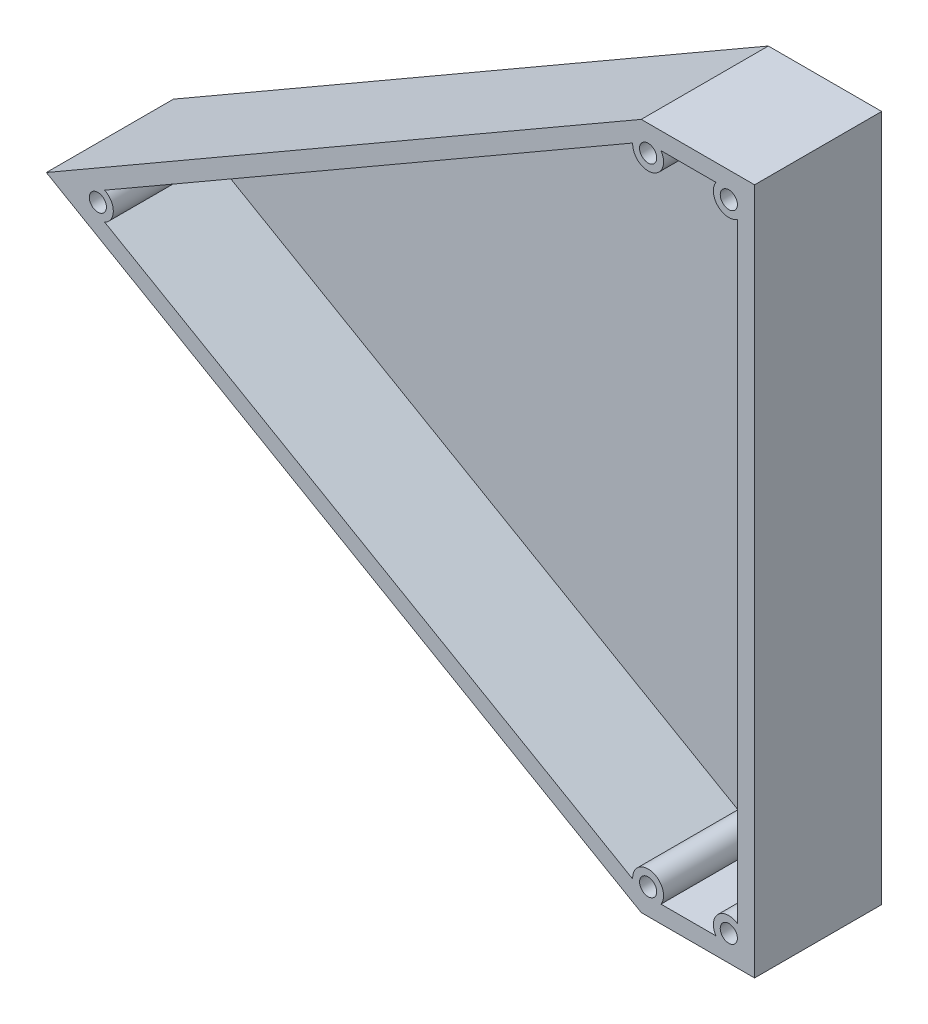
ISO-10303-21;
HEADER;
FILE_DESCRIPTION(('STEP AP214'),'2;1');
FILE_NAME('part.step','',(''),(''),'','','');
FILE_SCHEMA(('AUTOMOTIVE_DESIGN { 1 0 10303 214 1 1 1 1 }'));
ENDSEC;
DATA;
#1=APPLICATION_CONTEXT('core data for automotive mechanical design processes');
#2=APPLICATION_PROTOCOL_DEFINITION('international standard','automotive_design',2000,#1);
#3=PRODUCT_CONTEXT('',#1,'mechanical');
#4=PRODUCT('Part','Part','',(#3));
#5=PRODUCT_RELATED_PRODUCT_CATEGORY('part','',(#4));
#6=PRODUCT_DEFINITION_FORMATION('','',#4);
#7=PRODUCT_DEFINITION_CONTEXT('part definition',#1,'design');
#8=PRODUCT_DEFINITION('design','',#6,#7);
#9=PRODUCT_DEFINITION_SHAPE('','',#8);
#10=(LENGTH_UNIT() NAMED_UNIT(*) SI_UNIT(.MILLI.,.METRE.));
#11=(NAMED_UNIT(*) PLANE_ANGLE_UNIT() SI_UNIT($,.RADIAN.));
#12=(NAMED_UNIT(*) SI_UNIT($,.STERADIAN.) SOLID_ANGLE_UNIT());
#13=UNCERTAINTY_MEASURE_WITH_UNIT(LENGTH_MEASURE(1.E-05),#10,'distance_accuracy_value','');
#14=(GEOMETRIC_REPRESENTATION_CONTEXT(3) GLOBAL_UNCERTAINTY_ASSIGNED_CONTEXT((#13)) GLOBAL_UNIT_ASSIGNED_CONTEXT((#10,
#11,#12)) REPRESENTATION_CONTEXT('',''));
#15=CARTESIAN_POINT('',(0.,0.,0.));
#16=DIRECTION('',(0.,0.,1.));
#17=DIRECTION('',(1.,0.,0.));
#18=AXIS2_PLACEMENT_3D('',#15,#16,#17);
#19=CARTESIAN_POINT('',(-94.2275403784437,-163.206887407713,5.));
#20=DIRECTION('',(-0.499999999999999,-0.866025403784439,0.));
#21=DIRECTION('',(0.866025403784439,-0.499999999999999,0.));
#22=AXIS2_PLACEMENT_3D('',#19,#20,#21);
#23=PLANE('',#22);
#24=DIRECTION('',(-0.866025403784439,0.499999999999999,0.));
#25=VECTOR('',#24,1.);
#26=CARTESIAN_POINT('',(-94.2275403784437,-163.206887407713,0.));
#27=LINE('',#26,#25);
#28=CARTESIAN_POINT('',(-30.5,-200.,0.));
#29=VERTEX_POINT('',#28);
#30=CARTESIAN_POINT('',(-203.705080756888,-100.,0.));
#31=VERTEX_POINT('',#30);
#32=EDGE_CURVE('E241',#29,#31,#27,.T.);
#33=ORIENTED_EDGE('',*,*,#32,.F.);
#34=DIRECTION('',(0.,0.,-1.));
#35=VECTOR('',#34,1.);
#36=CARTESIAN_POINT('',(-30.5,-200.,5.));
#37=LINE('',#36,#35);
#38=CARTESIAN_POINT('',(-30.5,-200.,37.));
#39=VERTEX_POINT('',#38);
#40=EDGE_CURVE('E264',#39,#29,#37,.T.);
#41=ORIENTED_EDGE('',*,*,#40,.F.);
#42=DIRECTION('',(0.866025403784439,-0.499999999999999,0.));
#43=VECTOR('',#42,1.);
#44=CARTESIAN_POINT('',(-203.705080756888,-100.,37.));
#45=LINE('',#44,#43);
#46=CARTESIAN_POINT('',(-203.705080756888,-100.,37.));
#47=VERTEX_POINT('',#46);
#48=EDGE_CURVE('E229',#47,#39,#45,.T.);
#49=ORIENTED_EDGE('',*,*,#48,.F.);
#50=DIRECTION('',(0.,0.,-1.));
#51=VECTOR('',#50,1.);
#52=CARTESIAN_POINT('',(-203.705080756888,-100.,5.));
#53=LINE('',#52,#51);
#54=EDGE_CURVE('E256',#47,#31,#53,.T.);
#55=ORIENTED_EDGE('',*,*,#54,.T.);
#56=EDGE_LOOP('',(#33,#41,#49,#55));
#57=FACE_BOUND('',#56,.T.);
#58=ADVANCED_FACE('F33',(#57),#23,.T.);
#59=CARTESIAN_POINT('',(0.,-200.,5.));
#60=DIRECTION('',(0.,-1.,0.));
#61=DIRECTION('',(0.,0.,-1.));
#62=AXIS2_PLACEMENT_3D('',#59,#60,#61);
#63=PLANE('',#62);
#64=DIRECTION('',(-1.,0.,0.));
#65=VECTOR('',#64,1.);
#66=CARTESIAN_POINT('',(0.,-200.,0.));
#67=LINE('',#66,#65);
#68=CARTESIAN_POINT('',(2.50000000000002,-200.,0.));
#69=VERTEX_POINT('',#68);
#70=EDGE_CURVE('E244',#69,#29,#67,.T.);
#71=ORIENTED_EDGE('',*,*,#70,.F.);
#72=DIRECTION('',(0.,0.,-1.));
#73=VECTOR('',#72,1.);
#74=CARTESIAN_POINT('',(2.50000000000002,-200.,5.));
#75=LINE('',#74,#73);
#76=CARTESIAN_POINT('',(2.50000000000002,-200.,37.));
#77=VERTEX_POINT('',#76);
#78=EDGE_CURVE('E262',#77,#69,#75,.T.);
#79=ORIENTED_EDGE('',*,*,#78,.F.);
#80=DIRECTION('',(1.,0.,0.));
#81=VECTOR('',#80,1.);
#82=CARTESIAN_POINT('',(-30.5,-200.,37.));
#83=LINE('',#82,#81);
#84=EDGE_CURVE('E232',#39,#77,#83,.T.);
#85=ORIENTED_EDGE('',*,*,#84,.F.);
#86=ORIENTED_EDGE('',*,*,#40,.T.);
#87=EDGE_LOOP('',(#71,#79,#85,#86));
#88=FACE_BOUND('',#87,.T.);
#89=ADVANCED_FACE('F294',(#88),#63,.T.);
#90=CARTESIAN_POINT('',(2.5,0.,5.));
#91=DIRECTION('',(1.,0.,0.));
#92=DIRECTION('',(0.,1.,0.));
#93=AXIS2_PLACEMENT_3D('',#90,#91,#92);
#94=PLANE('',#93);
#95=DIRECTION('',(0.,-1.,0.));
#96=VECTOR('',#95,1.);
#97=CARTESIAN_POINT('',(2.5,0.,0.));
#98=LINE('',#97,#96);
#99=CARTESIAN_POINT('',(2.5,0.,0.));
#100=VERTEX_POINT('',#99);
#101=EDGE_CURVE('E247',#100,#69,#98,.T.);
#102=ORIENTED_EDGE('',*,*,#101,.F.);
#103=DIRECTION('',(0.,0.,-1.));
#104=VECTOR('',#103,1.);
#105=CARTESIAN_POINT('',(2.5,0.,5.));
#106=LINE('',#105,#104);
#107=CARTESIAN_POINT('',(2.5,0.,37.));
#108=VERTEX_POINT('',#107);
#109=EDGE_CURVE('E260',#108,#100,#106,.T.);
#110=ORIENTED_EDGE('',*,*,#109,.F.);
#111=DIRECTION('',(0.,1.,0.));
#112=VECTOR('',#111,1.);
#113=CARTESIAN_POINT('',(2.50000000000002,-200.,37.));
#114=LINE('',#113,#112);
#115=EDGE_CURVE('E235',#77,#108,#114,.T.);
#116=ORIENTED_EDGE('',*,*,#115,.F.);
#117=ORIENTED_EDGE('',*,*,#78,.T.);
#118=EDGE_LOOP('',(#102,#110,#116,#117));
#119=FACE_BOUND('',#118,.T.);
#120=ADVANCED_FACE('F300',(#119),#94,.T.);
#121=CARTESIAN_POINT('',(0.,0.,5.));
#122=DIRECTION('',(0.,-1.,0.));
#123=DIRECTION('',(1.,0.,0.));
#124=AXIS2_PLACEMENT_3D('',#121,#122,#123);
#125=PLANE('',#124);
#126=DIRECTION('',(-1.,0.,0.));
#127=VECTOR('',#126,1.);
#128=CARTESIAN_POINT('',(0.,0.,0.));
#129=LINE('',#128,#127);
#130=CARTESIAN_POINT('',(-30.4999999999997,-8.74300631892311E-13,0.));
#131=VERTEX_POINT('',#130);
#132=EDGE_CURVE('E250',#100,#131,#129,.T.);
#133=ORIENTED_EDGE('',*,*,#132,.T.);
#134=DIRECTION('',(0.,0.,-1.));
#135=VECTOR('',#134,1.);
#136=CARTESIAN_POINT('',(-30.4999999999997,-8.74300631892311E-13,5.));
#137=LINE('',#136,#135);
#138=CARTESIAN_POINT('',(-30.4999999999997,-8.74300631892311E-13,37.));
#139=VERTEX_POINT('',#138);
#140=EDGE_CURVE('E258',#139,#131,#137,.T.);
#141=ORIENTED_EDGE('',*,*,#140,.F.);
#142=DIRECTION('',(-1.,0.,0.));
#143=VECTOR('',#142,1.);
#144=CARTESIAN_POINT('',(2.5,0.,37.));
#145=LINE('',#144,#143);
#146=EDGE_CURVE('E238',#108,#139,#145,.T.);
#147=ORIENTED_EDGE('',*,*,#146,.F.);
#148=ORIENTED_EDGE('',*,*,#109,.T.);
#149=EDGE_LOOP('',(#133,#141,#147,#148));
#150=FACE_BOUND('',#149,.T.);
#151=ADVANCED_FACE('F317',(#150),#125,.F.);
#152=CARTESIAN_POINT('',(-7.62499999999943,13.2068874077118,5.));
#153=DIRECTION('',(-0.499999999999997,0.86602540378444,0.));
#154=DIRECTION('',(-0.866025403784441,-0.499999999999997,0.));
#155=AXIS2_PLACEMENT_3D('',#152,#153,#154);
#156=PLANE('',#155);
#157=DIRECTION('',(0.866025403784441,0.499999999999997,0.));
#158=VECTOR('',#157,1.);
#159=CARTESIAN_POINT('',(-7.62499999999943,13.2068874077118,0.));
#160=LINE('',#159,#158);
#161=EDGE_CURVE('E253',#31,#131,#160,.T.);
#162=ORIENTED_EDGE('',*,*,#161,.F.);
#163=ORIENTED_EDGE('',*,*,#54,.F.);
#164=DIRECTION('',(-0.866025403784441,-0.499999999999997,0.));
#165=VECTOR('',#164,1.);
#166=CARTESIAN_POINT('',(-30.4999999999997,-8.74300631892311E-13,37.));
#167=LINE('',#166,#165);
#168=EDGE_CURVE('E226',#139,#47,#167,.T.);
#169=ORIENTED_EDGE('',*,*,#168,.F.);
#170=ORIENTED_EDGE('',*,*,#140,.T.);
#171=EDGE_LOOP('',(#162,#163,#169,#170));
#172=FACE_BOUND('',#171,.T.);
#173=ADVANCED_FACE('F319',(#172),#156,.T.);
#174=CARTESIAN_POINT('',(0.,0.,0.));
#175=DIRECTION('',(0.,0.,1.));
#176=DIRECTION('',(1.,0.,0.));
#177=AXIS2_PLACEMENT_3D('',#174,#175,#176);
#178=PLANE('',#177);
#179=ORIENTED_EDGE('',*,*,#32,.T.);
#180=ORIENTED_EDGE('',*,*,#161,.T.);
#181=ORIENTED_EDGE('',*,*,#132,.F.);
#182=ORIENTED_EDGE('',*,*,#101,.T.);
#183=ORIENTED_EDGE('',*,*,#70,.T.);
#184=EDGE_LOOP('',(#179,#180,#181,#182,#183));
#185=FACE_BOUND('',#184,.T.);
#186=ADVANCED_FACE('F307',(#185),#178,.F.);
#187=CARTESIAN_POINT('',(0.,0.,37.));
#188=DIRECTION('',(0.,0.,1.));
#189=DIRECTION('',(1.,0.,0.));
#190=AXIS2_PLACEMENT_3D('',#187,#188,#189);
#191=PLANE('',#190);
#192=CARTESIAN_POINT('',(-28.4903810567665,-192.5,37.));
#193=DIRECTION('',(0.,0.,1.));
#194=DIRECTION('',(1.,0.,0.));
#195=AXIS2_PLACEMENT_3D('',#192,#193,#194);
#196=CIRCLE('',#195,2.5);
#197=CARTESIAN_POINT('',(-25.9903810567665,-192.5,37.));
#198=VERTEX_POINT('',#197);
#199=EDGE_CURVE('E583',#198,#198,#196,.T.);
#200=ORIENTED_EDGE('',*,*,#199,.F.);
#201=EDGE_LOOP('',(#200));
#202=FACE_BOUND('',#201,.T.);
#203=DIRECTION('',(0.866025403784438,-0.5,0.));
#204=VECTOR('',#203,1.);
#205=CARTESIAN_POINT('',(-186.714710407684,-104.035892202848,37.));
#206=LINE('',#205,#204);
#207=CARTESIAN_POINT('',(-186.714710407684,-104.035892202848,37.));
#208=VERTEX_POINT('',#207);
#209=CARTESIAN_POINT('',(-32.9807514059704,-192.794234816074,37.));
#210=VERTEX_POINT('',#209);
#211=EDGE_CURVE('E147',#208,#210,#206,.T.);
#212=ORIENTED_EDGE('',*,*,#211,.F.);
#213=CARTESIAN_POINT('',(-188.705080756888,-99.9999999999999,37.));
#214=DIRECTION('',(0.,0.,-1.));
#215=DIRECTION('',(1.,0.,0.));
#216=AXIS2_PLACEMENT_3D('',#213,#214,#215);
#217=CIRCLE('',#216,4.49999999999999);
#218=CARTESIAN_POINT('',(-186.714710407684,-95.964107797152,37.));
#219=VERTEX_POINT('',#218);
#220=EDGE_CURVE('E138',#219,#208,#217,.T.);
#221=ORIENTED_EDGE('',*,*,#220,.F.);
#222=DIRECTION('',(-0.866025403784439,-0.499999999999999,0.));
#223=VECTOR('',#222,1.);
#224=CARTESIAN_POINT('',(-186.714710407684,-95.964107797152,37.));
#225=LINE('',#224,#223);
#226=CARTESIAN_POINT('',(-32.9807514059704,-7.20576518392587,37.));
#227=VERTEX_POINT('',#226);
#228=EDGE_CURVE('E178',#227,#219,#225,.T.);
#229=ORIENTED_EDGE('',*,*,#228,.F.);
#230=CARTESIAN_POINT('',(-28.4903810567665,-7.50000000000001,37.));
#231=DIRECTION('',(0.,0.,-1.));
#232=DIRECTION('',(-1.,0.,0.));
#233=AXIS2_PLACEMENT_3D('',#230,#231,#232);
#234=CIRCLE('',#233,4.5);
#235=CARTESIAN_POINT('',(-24.7487236699925,-5.00000000000001,37.));
#236=VERTEX_POINT('',#235);
#237=EDGE_CURVE('E175',#236,#227,#234,.T.);
#238=ORIENTED_EDGE('',*,*,#237,.F.);
#239=DIRECTION('',(-1.,0.,0.));
#240=VECTOR('',#239,1.);
#241=CARTESIAN_POINT('',(-8.74165738677392,-5.,37.));
#242=LINE('',#241,#240);
#243=CARTESIAN_POINT('',(-8.74165738677392,-5.,37.));
#244=VERTEX_POINT('',#243);
#245=EDGE_CURVE('E173',#244,#236,#242,.T.);
#246=ORIENTED_EDGE('',*,*,#245,.F.);
#247=CARTESIAN_POINT('',(-4.99999999999998,-7.50000000000001,37.));
#248=DIRECTION('',(0.,0.,-1.));
#249=DIRECTION('',(-1.,0.,0.));
#250=AXIS2_PLACEMENT_3D('',#247,#248,#249);
#251=CIRCLE('',#250,4.50000000000001);
#252=CARTESIAN_POINT('',(-2.49999999999998,-11.241657386774,37.));
#253=VERTEX_POINT('',#252);
#254=EDGE_CURVE('E171',#253,#244,#251,.T.);
#255=ORIENTED_EDGE('',*,*,#254,.F.);
#256=DIRECTION('',(0.,1.,0.));
#257=VECTOR('',#256,1.);
#258=CARTESIAN_POINT('',(-2.49999999999998,-188.758342613226,37.));
#259=LINE('',#258,#257);
#260=CARTESIAN_POINT('',(-2.49999999999998,-188.758342613226,37.));
#261=VERTEX_POINT('',#260);
#262=EDGE_CURVE('E169',#261,#253,#259,.T.);
#263=ORIENTED_EDGE('',*,*,#262,.F.);
#264=CARTESIAN_POINT('',(-4.99999999999998,-192.5,37.));
#265=DIRECTION('',(0.,0.,-1.));
#266=DIRECTION('',(1.,0.,0.));
#267=AXIS2_PLACEMENT_3D('',#264,#265,#266);
#268=CIRCLE('',#267,4.50000000000001);
#269=CARTESIAN_POINT('',(-8.74165738677392,-195.,37.));
#270=VERTEX_POINT('',#269);
#271=EDGE_CURVE('E167',#270,#261,#268,.T.);
#272=ORIENTED_EDGE('',*,*,#271,.F.);
#273=DIRECTION('',(1.,0.,0.));
#274=VECTOR('',#273,1.);
#275=CARTESIAN_POINT('',(-24.7487236699925,-195.,37.));
#276=LINE('',#275,#274);
#277=CARTESIAN_POINT('',(-24.7487236699925,-195.,37.));
#278=VERTEX_POINT('',#277);
#279=EDGE_CURVE('E162',#278,#270,#276,.T.);
#280=ORIENTED_EDGE('',*,*,#279,.F.);
#281=CARTESIAN_POINT('',(-28.4903810567665,-192.5,37.));
#282=DIRECTION('',(0.,0.,-1.));
#283=DIRECTION('',(1.,0.,0.));
#284=AXIS2_PLACEMENT_3D('',#281,#282,#283);
#285=CIRCLE('',#284,4.5);
#286=EDGE_CURVE('E160',#210,#278,#285,.T.);
#287=ORIENTED_EDGE('',*,*,#286,.F.);
#288=EDGE_LOOP('',(#212,#221,#229,#238,#246,#255,#263,#272,#280,#287));
#289=FACE_BOUND('',#288,.T.);
#290=CARTESIAN_POINT('',(-4.99999999999998,-192.5,37.));
#291=DIRECTION('',(0.,0.,1.));
#292=DIRECTION('',(1.,0.,0.));
#293=AXIS2_PLACEMENT_3D('',#290,#291,#292);
#294=CIRCLE('',#293,2.5);
#295=CARTESIAN_POINT('',(-2.49999999999997,-192.5,37.));
#296=VERTEX_POINT('',#295);
#297=EDGE_CURVE('E153',#296,#296,#294,.T.);
#298=ORIENTED_EDGE('',*,*,#297,.F.);
#299=EDGE_LOOP('',(#298));
#300=FACE_BOUND('',#299,.T.);
#301=ORIENTED_EDGE('',*,*,#168,.T.);
#302=ORIENTED_EDGE('',*,*,#48,.T.);
#303=ORIENTED_EDGE('',*,*,#84,.T.);
#304=ORIENTED_EDGE('',*,*,#115,.T.);
#305=ORIENTED_EDGE('',*,*,#146,.T.);
#306=EDGE_LOOP('',(#301,#302,#303,#304,#305));
#307=FACE_BOUND('',#306,.T.);
#308=CARTESIAN_POINT('',(-188.705080756888,-99.9999999999999,37.));
#309=DIRECTION('',(0.,0.,1.));
#310=DIRECTION('',(1.,0.,0.));
#311=AXIS2_PLACEMENT_3D('',#308,#309,#310);
#312=CIRCLE('',#311,2.50000000000017);
#313=CARTESIAN_POINT('',(-186.205080756888,-99.9999999999999,37.));
#314=VERTEX_POINT('',#313);
#315=EDGE_CURVE('E223',#314,#314,#312,.T.);
#316=ORIENTED_EDGE('',*,*,#315,.F.);
#317=EDGE_LOOP('',(#316));
#318=FACE_BOUND('',#317,.T.);
#319=CARTESIAN_POINT('',(-4.99999999999998,-7.50000000000001,37.));
#320=DIRECTION('',(0.,0.,1.));
#321=DIRECTION('',(-1.,0.,0.));
#322=AXIS2_PLACEMENT_3D('',#319,#320,#321);
#323=CIRCLE('',#322,2.5);
#324=CARTESIAN_POINT('',(-7.49999999999998,-7.50000000000001,37.));
#325=VERTEX_POINT('',#324);
#326=EDGE_CURVE('E181',#325,#325,#323,.T.);
#327=ORIENTED_EDGE('',*,*,#326,.F.);
#328=EDGE_LOOP('',(#327));
#329=FACE_BOUND('',#328,.T.);
#330=CARTESIAN_POINT('',(-28.4903810567665,-7.50000000000001,37.));
#331=DIRECTION('',(0.,0.,1.));
#332=DIRECTION('',(-1.,0.,0.));
#333=AXIS2_PLACEMENT_3D('',#330,#331,#332);
#334=CIRCLE('',#333,2.5);
#335=CARTESIAN_POINT('',(-30.9903810567665,-7.50000000000001,37.));
#336=VERTEX_POINT('',#335);
#337=EDGE_CURVE('E581',#336,#336,#334,.T.);
#338=ORIENTED_EDGE('',*,*,#337,.F.);
#339=EDGE_LOOP('',(#338));
#340=FACE_BOUND('',#339,.T.);
#341=ADVANCED_FACE('F157',(#202,#289,#300,#307,#318,#329,#340),#191,.T.);
#342=CARTESIAN_POINT('',(-188.705080756888,-99.9999999999999,37.));
#343=DIRECTION('',(0.,0.,-1.));
#344=DIRECTION('',(-1.,0.,0.));
#345=AXIS2_PLACEMENT_3D('',#342,#343,#344);
#346=CYLINDRICAL_SURFACE('',#345,2.50000000000017);
#347=ORIENTED_EDGE('',*,*,#315,.T.);
#348=EDGE_LOOP('',(#347));
#349=FACE_BOUND('',#348,.T.);
#350=CARTESIAN_POINT('',(-188.705080756888,-99.9999999999999,5.));
#351=DIRECTION('',(0.,0.,1.));
#352=DIRECTION('',(1.,0.,0.));
#353=AXIS2_PLACEMENT_3D('',#350,#351,#352);
#354=CIRCLE('',#353,2.50000000000017);
#355=CARTESIAN_POINT('',(-186.205080756888,-99.9999999999999,5.));
#356=VERTEX_POINT('',#355);
#357=EDGE_CURVE('E11',#356,#356,#354,.F.);
#358=ORIENTED_EDGE('',*,*,#357,.T.);
#359=EDGE_LOOP('',(#358));
#360=FACE_BOUND('',#359,.T.);
#361=ADVANCED_FACE('F353',(#349,#360),#346,.F.);
#362=CARTESIAN_POINT('',(-4.99999999999998,-192.5,37.));
#363=DIRECTION('',(0.,0.,-1.));
#364=DIRECTION('',(-1.,0.,0.));
#365=AXIS2_PLACEMENT_3D('',#362,#363,#364);
#366=CYLINDRICAL_SURFACE('',#365,2.5);
#367=ORIENTED_EDGE('',*,*,#297,.T.);
#368=EDGE_LOOP('',(#367));
#369=FACE_BOUND('',#368,.T.);
#370=CARTESIAN_POINT('',(-4.99999999999998,-192.5,5.));
#371=DIRECTION('',(0.,0.,1.));
#372=DIRECTION('',(1.,0.,0.));
#373=AXIS2_PLACEMENT_3D('',#370,#371,#372);
#374=CIRCLE('',#373,2.5);
#375=CARTESIAN_POINT('',(-2.49999999999997,-192.5,5.));
#376=VERTEX_POINT('',#375);
#377=EDGE_CURVE('E40',#376,#376,#374,.F.);
#378=ORIENTED_EDGE('',*,*,#377,.T.);
#379=EDGE_LOOP('',(#378));
#380=FACE_BOUND('',#379,.T.);
#381=ADVANCED_FACE('F277',(#369,#380),#366,.F.);
#382=CARTESIAN_POINT('',(-188.705080756888,-99.9999999999999,37.));
#383=DIRECTION('',(0.,0.,-1.));
#384=DIRECTION('',(-1.,0.,0.));
#385=AXIS2_PLACEMENT_3D('',#382,#383,#384);
#386=CYLINDRICAL_SURFACE('',#385,4.49999999999999);
#387=CARTESIAN_POINT('',(-188.705080756888,-99.9999999999999,5.));
#388=DIRECTION('',(0.,0.,-1.));
#389=DIRECTION('',(1.,0.,0.));
#390=AXIS2_PLACEMENT_3D('',#387,#388,#389);
#391=CIRCLE('',#390,4.49999999999999);
#392=CARTESIAN_POINT('',(-186.714710407684,-95.964107797152,5.));
#393=VERTEX_POINT('',#392);
#394=CARTESIAN_POINT('',(-186.714710407684,-104.035892202848,5.));
#395=VERTEX_POINT('',#394);
#396=EDGE_CURVE('E47',#393,#395,#391,.T.);
#397=ORIENTED_EDGE('',*,*,#396,.F.);
#398=DIRECTION('',(0.,0.,-1.));
#399=VECTOR('',#398,1.);
#400=CARTESIAN_POINT('',(-186.714710407684,-95.964107797152,37.));
#401=LINE('',#400,#399);
#402=EDGE_CURVE('E143',#219,#393,#401,.T.);
#403=ORIENTED_EDGE('',*,*,#402,.F.);
#404=ORIENTED_EDGE('',*,*,#220,.T.);
#405=DIRECTION('',(0.,0.,-1.));
#406=VECTOR('',#405,1.);
#407=CARTESIAN_POINT('',(-186.714710407684,-104.035892202848,37.));
#408=LINE('',#407,#406);
#409=EDGE_CURVE('E141',#208,#395,#408,.T.);
#410=ORIENTED_EDGE('',*,*,#409,.T.);
#411=EDGE_LOOP('',(#397,#403,#404,#410));
#412=FACE_BOUND('',#411,.T.);
#413=ADVANCED_FACE('F140',(#412),#386,.T.);
#414=CARTESIAN_POINT('',(-186.714710407684,-104.035892202848,37.));
#415=DIRECTION('',(0.5,0.866025403784439,0.));
#416=DIRECTION('',(-0.866025403784439,0.5,0.));
#417=AXIS2_PLACEMENT_3D('',#414,#415,#416);
#418=PLANE('',#417);
#419=DIRECTION('',(0.866025403784438,-0.5,0.));
#420=VECTOR('',#419,1.);
#421=CARTESIAN_POINT('',(-186.714710407684,-104.035892202848,5.));
#422=LINE('',#421,#420);
#423=CARTESIAN_POINT('',(-32.9807514059704,-192.794234816074,5.));
#424=VERTEX_POINT('',#423);
#425=EDGE_CURVE('E51',#395,#424,#422,.T.);
#426=ORIENTED_EDGE('',*,*,#425,.F.);
#427=ORIENTED_EDGE('',*,*,#409,.F.);
#428=ORIENTED_EDGE('',*,*,#211,.T.);
#429=DIRECTION('',(0.,0.,-1.));
#430=VECTOR('',#429,1.);
#431=CARTESIAN_POINT('',(-32.9807514059704,-192.794234816074,37.));
#432=LINE('',#431,#430);
#433=EDGE_CURVE('E154',#210,#424,#432,.T.);
#434=ORIENTED_EDGE('',*,*,#433,.T.);
#435=EDGE_LOOP('',(#426,#427,#428,#434));
#436=FACE_BOUND('',#435,.T.);
#437=ADVANCED_FACE('F151',(#436),#418,.T.);
#438=CARTESIAN_POINT('',(-28.4903810567665,-192.5,37.));
#439=DIRECTION('',(0.,0.,-1.));
#440=DIRECTION('',(-1.,0.,0.));
#441=AXIS2_PLACEMENT_3D('',#438,#439,#440);
#442=CYLINDRICAL_SURFACE('',#441,4.5);
#443=CARTESIAN_POINT('',(-28.4903810567665,-192.5,5.));
#444=DIRECTION('',(0.,0.,-1.));
#445=DIRECTION('',(1.,0.,0.));
#446=AXIS2_PLACEMENT_3D('',#443,#444,#445);
#447=CIRCLE('',#446,4.5);
#448=CARTESIAN_POINT('',(-24.7487236699925,-195.,5.));
#449=VERTEX_POINT('',#448);
#450=EDGE_CURVE('E183',#424,#449,#447,.T.);
#451=ORIENTED_EDGE('',*,*,#450,.F.);
#452=ORIENTED_EDGE('',*,*,#433,.F.);
#453=ORIENTED_EDGE('',*,*,#286,.T.);
#454=DIRECTION('',(0.,0.,-1.));
#455=VECTOR('',#454,1.);
#456=CARTESIAN_POINT('',(-24.7487236699925,-195.,37.));
#457=LINE('',#456,#455);
#458=EDGE_CURVE('E217',#278,#449,#457,.T.);
#459=ORIENTED_EDGE('',*,*,#458,.T.);
#460=EDGE_LOOP('',(#451,#452,#453,#459));
#461=FACE_BOUND('',#460,.T.);
#462=ADVANCED_FACE('F388',(#461),#442,.T.);
#463=CARTESIAN_POINT('',(-24.7487236699925,-195.,37.));
#464=DIRECTION('',(0.,1.,0.));
#465=DIRECTION('',(0.,0.,1.));
#466=AXIS2_PLACEMENT_3D('',#463,#464,#465);
#467=PLANE('',#466);
#468=DIRECTION('',(1.,0.,0.));
#469=VECTOR('',#468,1.);
#470=CARTESIAN_POINT('',(-24.7487236699925,-195.,5.));
#471=LINE('',#470,#469);
#472=CARTESIAN_POINT('',(-8.74165738677392,-195.,5.));
#473=VERTEX_POINT('',#472);
#474=EDGE_CURVE('E185',#449,#473,#471,.T.);
#475=ORIENTED_EDGE('',*,*,#474,.F.);
#476=ORIENTED_EDGE('',*,*,#458,.F.);
#477=ORIENTED_EDGE('',*,*,#279,.T.);
#478=DIRECTION('',(0.,0.,-1.));
#479=VECTOR('',#478,1.);
#480=CARTESIAN_POINT('',(-8.74165738677392,-195.,37.));
#481=LINE('',#480,#479);
#482=EDGE_CURVE('E214',#270,#473,#481,.T.);
#483=ORIENTED_EDGE('',*,*,#482,.T.);
#484=EDGE_LOOP('',(#475,#476,#477,#483));
#485=FACE_BOUND('',#484,.T.);
#486=ADVANCED_FACE('F397',(#485),#467,.T.);
#487=CARTESIAN_POINT('',(-4.99999999999998,-192.5,37.));
#488=DIRECTION('',(0.,0.,-1.));
#489=DIRECTION('',(-1.,0.,0.));
#490=AXIS2_PLACEMENT_3D('',#487,#488,#489);
#491=CYLINDRICAL_SURFACE('',#490,4.50000000000001);
#492=CARTESIAN_POINT('',(-4.99999999999998,-192.5,5.));
#493=DIRECTION('',(0.,0.,-1.));
#494=DIRECTION('',(1.,0.,0.));
#495=AXIS2_PLACEMENT_3D('',#492,#493,#494);
#496=CIRCLE('',#495,4.50000000000001);
#497=CARTESIAN_POINT('',(-2.49999999999998,-188.758342613226,5.));
#498=VERTEX_POINT('',#497);
#499=EDGE_CURVE('E187',#473,#498,#496,.T.);
#500=ORIENTED_EDGE('',*,*,#499,.F.);
#501=ORIENTED_EDGE('',*,*,#482,.F.);
#502=ORIENTED_EDGE('',*,*,#271,.T.);
#503=DIRECTION('',(0.,0.,-1.));
#504=VECTOR('',#503,1.);
#505=CARTESIAN_POINT('',(-2.49999999999998,-188.758342613226,37.));
#506=LINE('',#505,#504);
#507=EDGE_CURVE('E211',#261,#498,#506,.T.);
#508=ORIENTED_EDGE('',*,*,#507,.T.);
#509=EDGE_LOOP('',(#500,#501,#502,#508));
#510=FACE_BOUND('',#509,.T.);
#511=ADVANCED_FACE('F407',(#510),#491,.T.);
#512=CARTESIAN_POINT('',(-2.49999999999998,-188.758342613226,37.));
#513=DIRECTION('',(-1.,0.,0.));
#514=DIRECTION('',(0.,0.,1.));
#515=AXIS2_PLACEMENT_3D('',#512,#513,#514);
#516=PLANE('',#515);
#517=DIRECTION('',(0.,1.,0.));
#518=VECTOR('',#517,1.);
#519=CARTESIAN_POINT('',(-2.49999999999998,-188.758342613226,5.));
#520=LINE('',#519,#518);
#521=CARTESIAN_POINT('',(-2.49999999999998,-11.241657386774,5.));
#522=VERTEX_POINT('',#521);
#523=EDGE_CURVE('E189',#498,#522,#520,.T.);
#524=ORIENTED_EDGE('',*,*,#523,.F.);
#525=ORIENTED_EDGE('',*,*,#507,.F.);
#526=ORIENTED_EDGE('',*,*,#262,.T.);
#527=DIRECTION('',(0.,0.,-1.));
#528=VECTOR('',#527,1.);
#529=CARTESIAN_POINT('',(-2.49999999999998,-11.241657386774,37.));
#530=LINE('',#529,#528);
#531=EDGE_CURVE('E208',#253,#522,#530,.T.);
#532=ORIENTED_EDGE('',*,*,#531,.T.);
#533=EDGE_LOOP('',(#524,#525,#526,#532));
#534=FACE_BOUND('',#533,.T.);
#535=ADVANCED_FACE('F417',(#534),#516,.T.);
#536=CARTESIAN_POINT('',(-4.99999999999998,-7.50000000000001,37.));
#537=DIRECTION('',(0.,0.,-1.));
#538=DIRECTION('',(-1.,0.,0.));
#539=AXIS2_PLACEMENT_3D('',#536,#537,#538);
#540=CYLINDRICAL_SURFACE('',#539,4.50000000000001);
#541=CARTESIAN_POINT('',(-4.99999999999998,-7.50000000000001,5.));
#542=DIRECTION('',(0.,0.,-1.));
#543=DIRECTION('',(-1.,0.,0.));
#544=AXIS2_PLACEMENT_3D('',#541,#542,#543);
#545=CIRCLE('',#544,4.50000000000001);
#546=CARTESIAN_POINT('',(-8.74165738677392,-5.,5.));
#547=VERTEX_POINT('',#546);
#548=EDGE_CURVE('E191',#522,#547,#545,.T.);
#549=ORIENTED_EDGE('',*,*,#548,.F.);
#550=ORIENTED_EDGE('',*,*,#531,.F.);
#551=ORIENTED_EDGE('',*,*,#254,.T.);
#552=DIRECTION('',(0.,0.,-1.));
#553=VECTOR('',#552,1.);
#554=CARTESIAN_POINT('',(-8.74165738677392,-5.,37.));
#555=LINE('',#554,#553);
#556=EDGE_CURVE('E205',#244,#547,#555,.T.);
#557=ORIENTED_EDGE('',*,*,#556,.T.);
#558=EDGE_LOOP('',(#549,#550,#551,#557));
#559=FACE_BOUND('',#558,.T.);
#560=ADVANCED_FACE('F427',(#559),#540,.T.);
#561=CARTESIAN_POINT('',(-8.74165738677392,-5.,37.));
#562=DIRECTION('',(0.,-1.,0.));
#563=DIRECTION('',(0.,0.,-1.));
#564=AXIS2_PLACEMENT_3D('',#561,#562,#563);
#565=PLANE('',#564);
#566=DIRECTION('',(-1.,0.,0.));
#567=VECTOR('',#566,1.);
#568=CARTESIAN_POINT('',(-8.74165738677392,-5.,5.));
#569=LINE('',#568,#567);
#570=CARTESIAN_POINT('',(-24.7487236699925,-5.,5.));
#571=VERTEX_POINT('',#570);
#572=EDGE_CURVE('E193',#547,#571,#569,.T.);
#573=ORIENTED_EDGE('',*,*,#572,.F.);
#574=ORIENTED_EDGE('',*,*,#556,.F.);
#575=ORIENTED_EDGE('',*,*,#245,.T.);
#576=DIRECTION('',(0.,0.,-1.));
#577=VECTOR('',#576,1.);
#578=CARTESIAN_POINT('',(-24.7487236699925,-5.00000000000001,37.));
#579=LINE('',#578,#577);
#580=EDGE_CURVE('E202',#236,#571,#579,.T.);
#581=ORIENTED_EDGE('',*,*,#580,.T.);
#582=EDGE_LOOP('',(#573,#574,#575,#581));
#583=FACE_BOUND('',#582,.T.);
#584=ADVANCED_FACE('F437',(#583),#565,.T.);
#585=CARTESIAN_POINT('',(-28.4903810567665,-7.50000000000001,37.));
#586=DIRECTION('',(0.,0.,-1.));
#587=DIRECTION('',(-1.,0.,0.));
#588=AXIS2_PLACEMENT_3D('',#585,#586,#587);
#589=CYLINDRICAL_SURFACE('',#588,4.5);
#590=CARTESIAN_POINT('',(-28.4903810567665,-7.50000000000001,5.));
#591=DIRECTION('',(0.,0.,-1.));
#592=DIRECTION('',(-1.,0.,0.));
#593=AXIS2_PLACEMENT_3D('',#590,#591,#592);
#594=CIRCLE('',#593,4.5);
#595=CARTESIAN_POINT('',(-32.9807514059704,-7.20576518392588,5.));
#596=VERTEX_POINT('',#595);
#597=EDGE_CURVE('E195',#571,#596,#594,.T.);
#598=ORIENTED_EDGE('',*,*,#597,.F.);
#599=ORIENTED_EDGE('',*,*,#580,.F.);
#600=ORIENTED_EDGE('',*,*,#237,.T.);
#601=DIRECTION('',(0.,0.,-1.));
#602=VECTOR('',#601,1.);
#603=CARTESIAN_POINT('',(-32.9807514059704,-7.20576518392588,37.));
#604=LINE('',#603,#602);
#605=EDGE_CURVE('E199',#227,#596,#604,.T.);
#606=ORIENTED_EDGE('',*,*,#605,.T.);
#607=EDGE_LOOP('',(#598,#599,#600,#606));
#608=FACE_BOUND('',#607,.T.);
#609=ADVANCED_FACE('F447',(#608),#589,.T.);
#610=CARTESIAN_POINT('',(-186.714710407684,-95.964107797152,37.));
#611=DIRECTION('',(0.5,-0.866025403784439,0.));
#612=DIRECTION('',(0.866025403784439,0.499999999999999,0.));
#613=AXIS2_PLACEMENT_3D('',#610,#611,#612);
#614=PLANE('',#613);
#615=DIRECTION('',(-0.866025403784439,-0.499999999999999,0.));
#616=VECTOR('',#615,1.);
#617=CARTESIAN_POINT('',(-186.714710407684,-95.964107797152,5.));
#618=LINE('',#617,#616);
#619=EDGE_CURVE('E148',#596,#393,#618,.T.);
#620=ORIENTED_EDGE('',*,*,#619,.F.);
#621=ORIENTED_EDGE('',*,*,#605,.F.);
#622=ORIENTED_EDGE('',*,*,#228,.T.);
#623=ORIENTED_EDGE('',*,*,#402,.T.);
#624=EDGE_LOOP('',(#620,#621,#622,#623));
#625=FACE_BOUND('',#624,.T.);
#626=ADVANCED_FACE('F457',(#625),#614,.T.);
#627=CARTESIAN_POINT('',(-4.99999999999998,-7.50000000000001,37.));
#628=DIRECTION('',(0.,0.,-1.));
#629=DIRECTION('',(-1.,0.,0.));
#630=AXIS2_PLACEMENT_3D('',#627,#628,#629);
#631=CYLINDRICAL_SURFACE('',#630,2.5);
#632=ORIENTED_EDGE('',*,*,#326,.T.);
#633=EDGE_LOOP('',(#632));
#634=FACE_BOUND('',#633,.T.);
#635=CARTESIAN_POINT('',(-4.99999999999998,-7.50000000000001,5.));
#636=DIRECTION('',(0.,0.,1.));
#637=DIRECTION('',(1.,0.,0.));
#638=AXIS2_PLACEMENT_3D('',#635,#636,#637);
#639=CIRCLE('',#638,2.5);
#640=CARTESIAN_POINT('',(-2.49999999999997,-7.50000000000001,5.));
#641=VERTEX_POINT('',#640);
#642=EDGE_CURVE('E272',#641,#641,#639,.F.);
#643=ORIENTED_EDGE('',*,*,#642,.T.);
#644=EDGE_LOOP('',(#643));
#645=FACE_BOUND('',#644,.T.);
#646=ADVANCED_FACE('F467',(#634,#645),#631,.F.);
#647=CARTESIAN_POINT('',(-28.4903810567665,-192.5,37.));
#648=DIRECTION('',(0.,0.,-1.));
#649=DIRECTION('',(-1.,0.,0.));
#650=AXIS2_PLACEMENT_3D('',#647,#648,#649);
#651=CYLINDRICAL_SURFACE('',#650,2.5);
#652=ORIENTED_EDGE('',*,*,#199,.T.);
#653=EDGE_LOOP('',(#652));
#654=FACE_BOUND('',#653,.T.);
#655=CARTESIAN_POINT('',(-28.4903810567665,-192.5,5.));
#656=DIRECTION('',(0.,0.,1.));
#657=DIRECTION('',(1.,0.,0.));
#658=AXIS2_PLACEMENT_3D('',#655,#656,#657);
#659=CIRCLE('',#658,2.5);
#660=CARTESIAN_POINT('',(-25.9903810567665,-192.5,5.));
#661=VERTEX_POINT('',#660);
#662=EDGE_CURVE('E269',#661,#661,#659,.F.);
#663=ORIENTED_EDGE('',*,*,#662,.T.);
#664=EDGE_LOOP('',(#663));
#665=FACE_BOUND('',#664,.T.);
#666=ADVANCED_FACE('F477',(#654,#665),#651,.F.);
#667=CARTESIAN_POINT('',(-28.4903810567665,-7.50000000000001,37.));
#668=DIRECTION('',(0.,0.,-1.));
#669=DIRECTION('',(-1.,0.,0.));
#670=AXIS2_PLACEMENT_3D('',#667,#668,#669);
#671=CYLINDRICAL_SURFACE('',#670,2.5);
#672=ORIENTED_EDGE('',*,*,#337,.T.);
#673=EDGE_LOOP('',(#672));
#674=FACE_BOUND('',#673,.T.);
#675=CARTESIAN_POINT('',(-28.4903810567665,-7.50000000000001,5.));
#676=DIRECTION('',(0.,0.,1.));
#677=DIRECTION('',(1.,0.,0.));
#678=AXIS2_PLACEMENT_3D('',#675,#676,#677);
#679=CIRCLE('',#678,2.5);
#680=CARTESIAN_POINT('',(-25.9903810567665,-7.50000000000001,5.));
#681=VERTEX_POINT('',#680);
#682=EDGE_CURVE('E266',#681,#681,#679,.F.);
#683=ORIENTED_EDGE('',*,*,#682,.T.);
#684=EDGE_LOOP('',(#683));
#685=FACE_BOUND('',#684,.T.);
#686=ADVANCED_FACE('F487',(#674,#685),#671,.F.);
#687=CARTESIAN_POINT('',(0.,0.,5.));
#688=DIRECTION('',(0.,0.,1.));
#689=DIRECTION('',(1.,0.,0.));
#690=AXIS2_PLACEMENT_3D('',#687,#688,#689);
#691=PLANE('',#690);
#692=ORIENTED_EDGE('',*,*,#682,.F.);
#693=EDGE_LOOP('',(#692));
#694=FACE_BOUND('',#693,.T.);
#695=ADVANCED_FACE('F289',(#694),#691,.T.);
#696=ORIENTED_EDGE('',*,*,#662,.F.);
#697=EDGE_LOOP('',(#696));
#698=FACE_BOUND('',#697,.T.);
#699=ADVANCED_FACE('F505',(#698),#691,.T.);
#700=ORIENTED_EDGE('',*,*,#642,.F.);
#701=EDGE_LOOP('',(#700));
#702=FACE_BOUND('',#701,.T.);
#703=ADVANCED_FACE('F290',(#702),#691,.T.);
#704=ORIENTED_EDGE('',*,*,#396,.T.);
#705=ORIENTED_EDGE('',*,*,#425,.T.);
#706=ORIENTED_EDGE('',*,*,#450,.T.);
#707=ORIENTED_EDGE('',*,*,#474,.T.);
#708=ORIENTED_EDGE('',*,*,#499,.T.);
#709=ORIENTED_EDGE('',*,*,#523,.T.);
#710=ORIENTED_EDGE('',*,*,#548,.T.);
#711=ORIENTED_EDGE('',*,*,#572,.T.);
#712=ORIENTED_EDGE('',*,*,#597,.T.);
#713=ORIENTED_EDGE('',*,*,#619,.T.);
#714=EDGE_LOOP('',(#704,#705,#706,#707,#708,#709,#710,#711,#712,#713));
#715=FACE_BOUND('',#714,.T.);
#716=ADVANCED_FACE('F282',(#715),#691,.T.);
#717=ORIENTED_EDGE('',*,*,#377,.F.);
#718=EDGE_LOOP('',(#717));
#719=FACE_BOUND('',#718,.T.);
#720=ADVANCED_FACE('F279',(#719),#691,.T.);
#721=ORIENTED_EDGE('',*,*,#357,.F.);
#722=EDGE_LOOP('',(#721));
#723=FACE_BOUND('',#722,.T.);
#724=ADVANCED_FACE('F281',(#723),#691,.T.);
#725=CLOSED_SHELL('',(#58,#89,#120,#151,#173,#186,#341,#361,#381,#413,#437,#462,#486,#511,#535,
#560,#584,#609,#626,#646,#666,#686,#695,#699,#703,#716,#720,#724));
#726=MANIFOLD_SOLID_BREP('B2',#725);
#727=ADVANCED_BREP_SHAPE_REPRESENTATION('',(#18,#726),#14);
#728=SHAPE_DEFINITION_REPRESENTATION(#9,#727);
ENDSEC;
END-ISO-10303-21;
